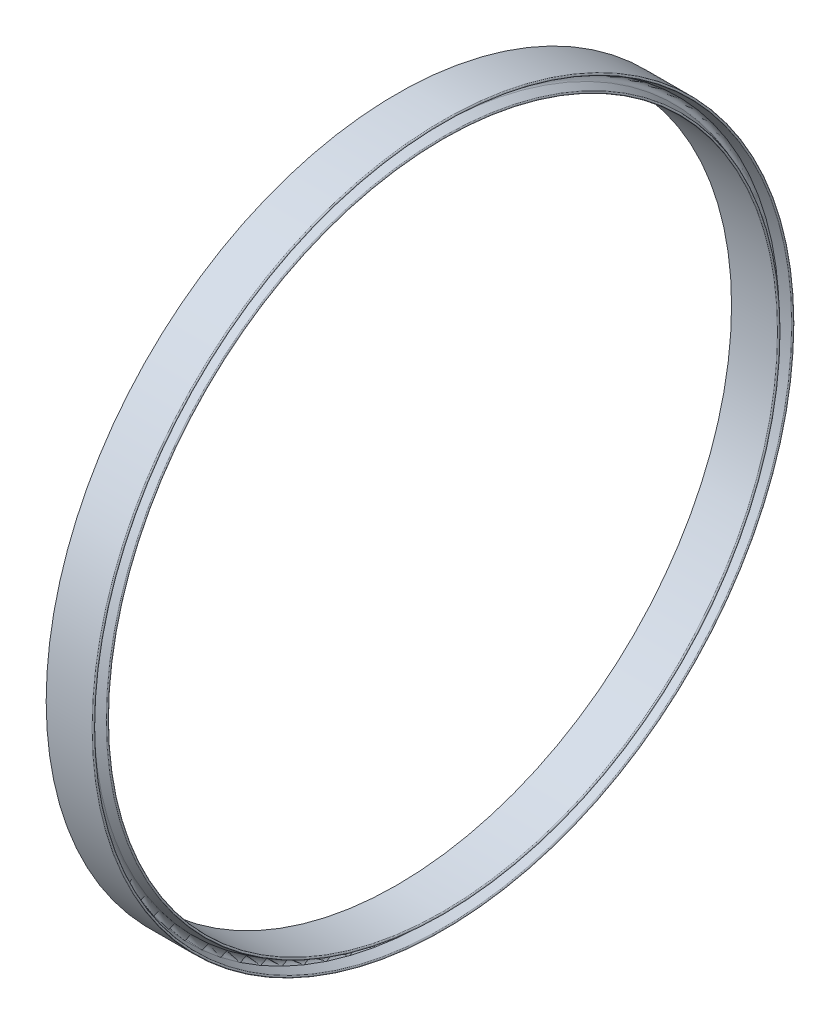
ISO-10303-21;
HEADER;
FILE_DESCRIPTION(('STEP AP214'),'2;1');
FILE_NAME('part.step','',(''),(''),'','','');
FILE_SCHEMA(('AUTOMOTIVE_DESIGN { 1 0 10303 214 1 1 1 1 }'));
ENDSEC;
DATA;
#1=APPLICATION_CONTEXT('core data for automotive mechanical design processes');
#2=APPLICATION_PROTOCOL_DEFINITION('international standard','automotive_design',2000,#1);
#3=PRODUCT_CONTEXT('',#1,'mechanical');
#4=PRODUCT('Part','Part','',(#3));
#5=PRODUCT_RELATED_PRODUCT_CATEGORY('part','',(#4));
#6=PRODUCT_DEFINITION_FORMATION('','',#4);
#7=PRODUCT_DEFINITION_CONTEXT('part definition',#1,'design');
#8=PRODUCT_DEFINITION('design','',#6,#7);
#9=PRODUCT_DEFINITION_SHAPE('','',#8);
#10=(LENGTH_UNIT() NAMED_UNIT(*) SI_UNIT(.MILLI.,.METRE.));
#11=(NAMED_UNIT(*) PLANE_ANGLE_UNIT() SI_UNIT($,.RADIAN.));
#12=(NAMED_UNIT(*) SI_UNIT($,.STERADIAN.) SOLID_ANGLE_UNIT());
#13=UNCERTAINTY_MEASURE_WITH_UNIT(LENGTH_MEASURE(1.E-05),#10,'distance_accuracy_value','');
#14=(GEOMETRIC_REPRESENTATION_CONTEXT(3) GLOBAL_UNCERTAINTY_ASSIGNED_CONTEXT((#13)) GLOBAL_UNIT_ASSIGNED_CONTEXT((#10,
#11,#12)) REPRESENTATION_CONTEXT('',''));
#15=CARTESIAN_POINT('',(0.,0.,0.));
#16=DIRECTION('',(0.,0.,1.));
#17=DIRECTION('',(1.,0.,0.));
#18=AXIS2_PLACEMENT_3D('',#15,#16,#17);
#19=CARTESIAN_POINT('',(-62.7524365503539,-31.5,0.));
#20=DIRECTION('',(-1.,0.,0.));
#21=DIRECTION('',(0.,0.,1.));
#22=AXIS2_PLACEMENT_3D('',#19,#20,#21);
#23=PLANE('',#22);
#24=CARTESIAN_POINT('',(-62.7524365503539,0.,0.));
#25=DIRECTION('',(-1.,0.,0.));
#26=DIRECTION('',(0.,0.,1.));
#27=AXIS2_PLACEMENT_3D('',#24,#25,#26);
#28=CIRCLE('',#27,33.);
#29=CARTESIAN_POINT('',(-62.7524365503539,0.,33.));
#30=VERTEX_POINT('',#29);
#31=EDGE_CURVE('E10',#30,#30,#28,.T.);
#32=ORIENTED_EDGE('',*,*,#31,.T.);
#33=EDGE_LOOP('',(#32));
#34=FACE_BOUND('',#33,.T.);
#35=CARTESIAN_POINT('',(-62.7524365503539,0.,0.));
#36=DIRECTION('',(-1.,0.,0.));
#37=DIRECTION('',(0.,0.,1.));
#38=AXIS2_PLACEMENT_3D('',#35,#36,#37);
#39=CIRCLE('',#38,31.5);
#40=CARTESIAN_POINT('',(-62.7524365503539,0.,31.5));
#41=VERTEX_POINT('',#40);
#42=EDGE_CURVE('E72',#41,#41,#39,.T.);
#43=ORIENTED_EDGE('',*,*,#42,.F.);
#44=EDGE_LOOP('',(#43));
#45=FACE_BOUND('',#44,.T.);
#46=ADVANCED_FACE('F34',(#34,#45),#23,.T.);
#47=CARTESIAN_POINT('',(-79.1226373895766,0.,0.));
#48=DIRECTION('',(-1.,0.,0.));
#49=DIRECTION('',(0.,0.,1.));
#50=AXIS2_PLACEMENT_3D('',#47,#48,#49);
#51=CYLINDRICAL_SURFACE('',#50,33.);
#52=CARTESIAN_POINT('',(-58.4337801006509,0.,0.));
#53=DIRECTION('',(-1.,0.,0.));
#54=DIRECTION('',(0.,0.,1.));
#55=AXIS2_PLACEMENT_3D('',#52,#53,#54);
#56=CIRCLE('',#55,33.);
#57=CARTESIAN_POINT('',(-58.4337801006509,0.,33.));
#58=VERTEX_POINT('',#57);
#59=EDGE_CURVE('E41',#58,#58,#56,.T.);
#60=ORIENTED_EDGE('',*,*,#59,.T.);
#61=EDGE_LOOP('',(#60));
#62=FACE_BOUND('',#61,.T.);
#63=ORIENTED_EDGE('',*,*,#31,.F.);
#64=EDGE_LOOP('',(#63));
#65=FACE_BOUND('',#64,.T.);
#66=ADVANCED_FACE('F82',(#62,#65),#51,.T.);
#67=CARTESIAN_POINT('',(-58.4337801006509,0.,0.));
#68=DIRECTION('',(-1.,0.,0.));
#69=DIRECTION('',(0.,0.,1.));
#70=AXIS2_PLACEMENT_3D('',#67,#68,#69);
#71=TOROIDAL_SURFACE('',#70,32.9,0.0999999999999996);
#72=CARTESIAN_POINT('',(-58.4050453120942,0.,0.));
#73=DIRECTION('',(-1.,0.,0.));
#74=DIRECTION('',(0.,0.,1.));
#75=AXIS2_PLACEMENT_3D('',#72,#73,#74);
#76=CIRCLE('',#75,32.8042173714779);
#77=CARTESIAN_POINT('',(-58.4050453120942,0.,32.8042173714779));
#78=VERTEX_POINT('',#77);
#79=EDGE_CURVE('E48',#78,#78,#76,.T.);
#80=ORIENTED_EDGE('',*,*,#79,.T.);
#81=EDGE_LOOP('',(#80));
#82=FACE_BOUND('',#81,.T.);
#83=ORIENTED_EDGE('',*,*,#59,.F.);
#84=EDGE_LOOP('',(#83));
#85=FACE_BOUND('',#84,.T.);
#86=ADVANCED_FACE('F86',(#82,#85),#71,.T.);
#87=CARTESIAN_POINT('',(-58.4050453120942,0.,0.));
#88=DIRECTION('',(1.,0.,0.));
#89=DIRECTION('',(0.,0.,-1.));
#90=AXIS2_PLACEMENT_3D('',#87,#88,#89);
#91=CONICAL_SURFACE('',#90,32.8042173714779,0.291456794477874);
#92=CARTESIAN_POINT('',(-59.2946102651327,0.,0.));
#93=DIRECTION('',(-1.,0.,0.));
#94=DIRECTION('',(0.,0.,1.));
#95=AXIS2_PLACEMENT_3D('',#92,#93,#94);
#96=CIRCLE('',#95,32.5373478855663);
#97=CARTESIAN_POINT('',(-59.2946102651327,0.,32.5373478855663));
#98=VERTEX_POINT('',#97);
#99=EDGE_CURVE('E54',#98,#98,#96,.T.);
#100=ORIENTED_EDGE('',*,*,#99,.T.);
#101=EDGE_LOOP('',(#100));
#102=FACE_BOUND('',#101,.T.);
#103=ORIENTED_EDGE('',*,*,#79,.F.);
#104=EDGE_LOOP('',(#103));
#105=FACE_BOUND('',#104,.T.);
#106=ADVANCED_FACE('F90',(#102,#105),#91,.F.);
#107=CARTESIAN_POINT('',(-59.2084058994628,0.,0.));
#108=DIRECTION('',(-1.,0.,0.));
#109=DIRECTION('',(0.,0.,1.));
#110=AXIS2_PLACEMENT_3D('',#107,#108,#109);
#111=TOROIDAL_SURFACE('',#110,32.25,0.299999999999999);
#112=CARTESIAN_POINT('',(-59.2946102651327,0.,0.));
#113=DIRECTION('',(-1.,0.,0.));
#114=DIRECTION('',(0.,0.,1.));
#115=AXIS2_PLACEMENT_3D('',#112,#113,#114);
#116=CIRCLE('',#115,31.9626521144337);
#117=CARTESIAN_POINT('',(-59.2946102651327,0.,31.9626521144337));
#118=VERTEX_POINT('',#117);
#119=EDGE_CURVE('E60',#118,#118,#116,.T.);
#120=ORIENTED_EDGE('',*,*,#119,.T.);
#121=EDGE_LOOP('',(#120));
#122=FACE_BOUND('',#121,.T.);
#123=ORIENTED_EDGE('',*,*,#99,.F.);
#124=EDGE_LOOP('',(#123));
#125=FACE_BOUND('',#124,.T.);
#126=ADVANCED_FACE('F97',(#122,#125),#111,.F.);
#127=CARTESIAN_POINT('',(-59.2946102651327,0.,0.));
#128=DIRECTION('',(-1.,0.,0.));
#129=DIRECTION('',(0.,0.,1.));
#130=AXIS2_PLACEMENT_3D('',#127,#128,#129);
#131=CONICAL_SURFACE('',#130,31.9626521144337,0.291456794477866);
#132=CARTESIAN_POINT('',(-58.4050453120942,0.,0.));
#133=DIRECTION('',(-1.,0.,0.));
#134=DIRECTION('',(0.,0.,1.));
#135=AXIS2_PLACEMENT_3D('',#132,#133,#134);
#136=CIRCLE('',#135,31.6957826285221);
#137=CARTESIAN_POINT('',(-58.4050453120942,0.,31.6957826285221));
#138=VERTEX_POINT('',#137);
#139=EDGE_CURVE('E64',#138,#138,#136,.T.);
#140=ORIENTED_EDGE('',*,*,#139,.T.);
#141=EDGE_LOOP('',(#140));
#142=FACE_BOUND('',#141,.T.);
#143=ORIENTED_EDGE('',*,*,#119,.F.);
#144=EDGE_LOOP('',(#143));
#145=FACE_BOUND('',#144,.T.);
#146=ADVANCED_FACE('F101',(#142,#145),#131,.T.);
#147=CARTESIAN_POINT('',(-58.4337801006509,0.,0.));
#148=DIRECTION('',(-1.,0.,0.));
#149=DIRECTION('',(0.,0.,1.));
#150=AXIS2_PLACEMENT_3D('',#147,#148,#149);
#151=TOROIDAL_SURFACE('',#150,31.6,0.0999999999999996);
#152=CARTESIAN_POINT('',(-58.4337801006509,0.,0.));
#153=DIRECTION('',(-1.,0.,0.));
#154=DIRECTION('',(0.,0.,1.));
#155=AXIS2_PLACEMENT_3D('',#152,#153,#154);
#156=CIRCLE('',#155,31.5);
#157=CARTESIAN_POINT('',(-58.4337801006509,0.,31.5));
#158=VERTEX_POINT('',#157);
#159=EDGE_CURVE('E68',#158,#158,#156,.T.);
#160=ORIENTED_EDGE('',*,*,#159,.T.);
#161=EDGE_LOOP('',(#160));
#162=FACE_BOUND('',#161,.T.);
#163=ORIENTED_EDGE('',*,*,#139,.F.);
#164=EDGE_LOOP('',(#163));
#165=FACE_BOUND('',#164,.T.);
#166=ADVANCED_FACE('F105',(#162,#165),#151,.T.);
#167=CARTESIAN_POINT('',(-79.1226373895766,0.,0.));
#168=DIRECTION('',(-1.,0.,0.));
#169=DIRECTION('',(0.,0.,1.));
#170=AXIS2_PLACEMENT_3D('',#167,#168,#169);
#171=CYLINDRICAL_SURFACE('',#170,31.5);
#172=ORIENTED_EDGE('',*,*,#42,.T.);
#173=EDGE_LOOP('',(#172));
#174=FACE_BOUND('',#173,.T.);
#175=ORIENTED_EDGE('',*,*,#159,.F.);
#176=EDGE_LOOP('',(#175));
#177=FACE_BOUND('',#176,.T.);
#178=ADVANCED_FACE('F78',(#174,#177),#171,.F.);
#179=CLOSED_SHELL('',(#46,#66,#86,#106,#126,#146,#166,#178));
#180=MANIFOLD_SOLID_BREP('B2',#179);
#181=ADVANCED_BREP_SHAPE_REPRESENTATION('',(#18,#180),#14);
#182=SHAPE_DEFINITION_REPRESENTATION(#9,#181);
ENDSEC;
END-ISO-10303-21;
